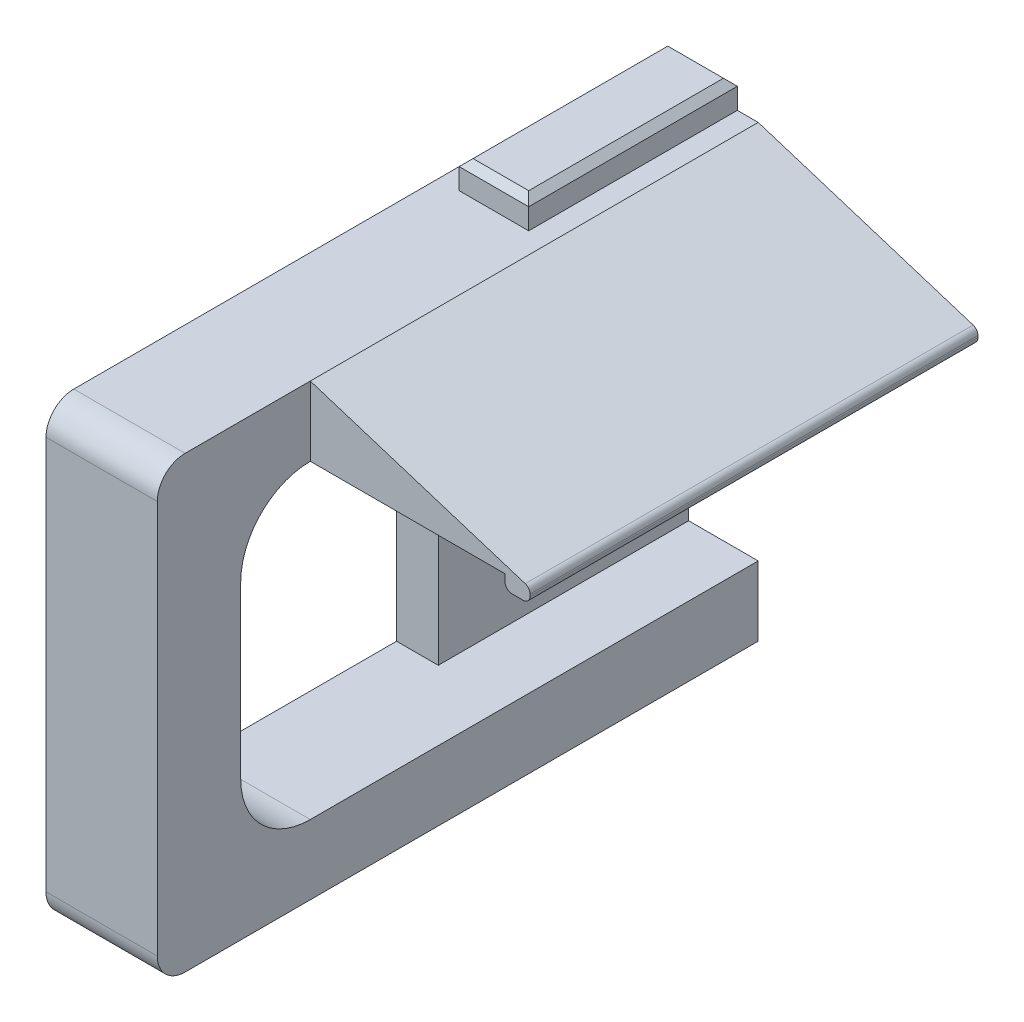
ISO-10303-21;
HEADER;
FILE_DESCRIPTION(('STEP AP214'),'2;1');
FILE_NAME('part.step','',(''),(''),'','','');
FILE_SCHEMA(('AUTOMOTIVE_DESIGN { 1 0 10303 214 1 1 1 1 }'));
ENDSEC;
DATA;
#1=APPLICATION_CONTEXT('core data for automotive mechanical design processes');
#2=APPLICATION_PROTOCOL_DEFINITION('international standard','automotive_design',2000,#1);
#3=PRODUCT_CONTEXT('',#1,'mechanical');
#4=PRODUCT('Part','Part','',(#3));
#5=PRODUCT_RELATED_PRODUCT_CATEGORY('part','',(#4));
#6=PRODUCT_DEFINITION_FORMATION('','',#4);
#7=PRODUCT_DEFINITION_CONTEXT('part definition',#1,'design');
#8=PRODUCT_DEFINITION('design','',#6,#7);
#9=PRODUCT_DEFINITION_SHAPE('','',#8);
#10=(LENGTH_UNIT() NAMED_UNIT(*) SI_UNIT(.MILLI.,.METRE.));
#11=(NAMED_UNIT(*) PLANE_ANGLE_UNIT() SI_UNIT($,.RADIAN.));
#12=(NAMED_UNIT(*) SI_UNIT($,.STERADIAN.) SOLID_ANGLE_UNIT());
#13=UNCERTAINTY_MEASURE_WITH_UNIT(LENGTH_MEASURE(1.E-05),#10,'distance_accuracy_value','');
#14=(GEOMETRIC_REPRESENTATION_CONTEXT(3) GLOBAL_UNCERTAINTY_ASSIGNED_CONTEXT((#13)) GLOBAL_UNIT_ASSIGNED_CONTEXT((#10,
#11,#12)) REPRESENTATION_CONTEXT('',''));
#15=CARTESIAN_POINT('',(0.,0.,0.));
#16=DIRECTION('',(0.,0.,1.));
#17=DIRECTION('',(1.,0.,0.));
#18=AXIS2_PLACEMENT_3D('',#15,#16,#17);
#19=CARTESIAN_POINT('',(-3.,27.3,0.));
#20=DIRECTION('',(0.,-1.,0.));
#21=DIRECTION('',(0.,0.,-1.));
#22=AXIS2_PLACEMENT_3D('',#19,#20,#21);
#23=PLANE('',#22);
#24=DIRECTION('',(0.,0.,1.));
#25=VECTOR('',#24,1.);
#26=CARTESIAN_POINT('',(3.49999999999992,27.3,15.));
#27=LINE('',#26,#25);
#28=CARTESIAN_POINT('',(3.49999999999992,27.3,0.));
#29=VERTEX_POINT('',#28);
#30=CARTESIAN_POINT('',(3.49999999999992,27.3,15.));
#31=VERTEX_POINT('',#30);
#32=EDGE_CURVE('E234',#29,#31,#27,.T.);
#33=ORIENTED_EDGE('',*,*,#32,.T.);
#34=DIRECTION('',(-1.,0.,0.));
#35=VECTOR('',#34,1.);
#36=CARTESIAN_POINT('',(3.49999999999992,27.3,15.));
#37=LINE('',#36,#35);
#38=CARTESIAN_POINT('',(-1.50000000000008,27.3,15.));
#39=VERTEX_POINT('',#38);
#40=EDGE_CURVE('E245',#31,#39,#37,.T.);
#41=ORIENTED_EDGE('',*,*,#40,.T.);
#42=DIRECTION('',(0.,0.,-1.));
#43=VECTOR('',#42,1.);
#44=CARTESIAN_POINT('',(-1.50000000000008,27.3,15.));
#45=LINE('',#44,#43);
#46=CARTESIAN_POINT('',(-1.50000000000007,27.3,0.));
#47=VERTEX_POINT('',#46);
#48=EDGE_CURVE('E229',#39,#47,#45,.T.);
#49=ORIENTED_EDGE('',*,*,#48,.T.);
#50=DIRECTION('',(1.,0.,0.));
#51=VECTOR('',#50,1.);
#52=CARTESIAN_POINT('',(-3.,27.3,0.));
#53=LINE('',#52,#51);
#54=CARTESIAN_POINT('',(-3.,27.3,0.));
#55=VERTEX_POINT('',#54);
#56=EDGE_CURVE('E238',#55,#47,#53,.T.);
#57=ORIENTED_EDGE('',*,*,#56,.F.);
#58=DIRECTION('',(0.,0.,1.));
#59=VECTOR('',#58,1.);
#60=CARTESIAN_POINT('',(-3.,27.3,0.));
#61=LINE('',#60,#59);
#62=CARTESIAN_POINT('',(-3.,27.3,41.2));
#63=VERTEX_POINT('',#62);
#64=EDGE_CURVE('E361',#55,#63,#61,.T.);
#65=ORIENTED_EDGE('',*,*,#64,.T.);
#66=DIRECTION('',(1.,0.,0.));
#67=VECTOR('',#66,1.);
#68=CARTESIAN_POINT('',(-3.,27.3,41.2));
#69=LINE('',#68,#67);
#70=CARTESIAN_POINT('',(5.,27.3,41.2));
#71=VERTEX_POINT('',#70);
#72=EDGE_CURVE('E239',#63,#71,#69,.T.);
#73=ORIENTED_EDGE('',*,*,#72,.T.);
#74=DIRECTION('',(0.,0.,1.));
#75=VECTOR('',#74,1.);
#76=CARTESIAN_POINT('',(5.,27.3,0.));
#77=LINE('',#76,#75);
#78=CARTESIAN_POINT('',(5.,27.3,32.2));
#79=VERTEX_POINT('',#78);
#80=EDGE_CURVE('E330',#79,#71,#77,.T.);
#81=ORIENTED_EDGE('',*,*,#80,.F.);
#82=DIRECTION('',(0.,0.,1.));
#83=VECTOR('',#82,1.);
#84=CARTESIAN_POINT('',(4.99999999999985,27.3,32.2));
#85=LINE('',#84,#83);
#86=CARTESIAN_POINT('',(4.99999999999985,27.3,0.));
#87=VERTEX_POINT('',#86);
#88=EDGE_CURVE('E237',#87,#79,#85,.T.);
#89=ORIENTED_EDGE('',*,*,#88,.F.);
#90=EDGE_CURVE('E220',#29,#87,#53,.T.);
#91=ORIENTED_EDGE('',*,*,#90,.F.);
#92=EDGE_LOOP('',(#33,#41,#49,#57,#65,#73,#81,#89,#91));
#93=FACE_BOUND('',#92,.T.);
#94=ADVANCED_FACE('F35',(#93),#23,.F.);
#95=CARTESIAN_POINT('',(-3.,22.3,0.));
#96=DIRECTION('',(0.,1.,0.));
#97=DIRECTION('',(0.,0.,1.));
#98=AXIS2_PLACEMENT_3D('',#95,#96,#97);
#99=PLANE('',#98);
#100=DIRECTION('',(0.,0.,1.));
#101=VECTOR('',#100,1.);
#102=CARTESIAN_POINT('',(19.,22.3,0.));
#103=LINE('',#102,#101);
#104=CARTESIAN_POINT('',(19.,22.3,0.));
#105=VERTEX_POINT('',#104);
#106=CARTESIAN_POINT('',(19.,22.3,32.2));
#107=VERTEX_POINT('',#106);
#108=EDGE_CURVE('E255',#105,#107,#103,.T.);
#109=ORIENTED_EDGE('',*,*,#108,.T.);
#110=DIRECTION('',(-1.,0.,0.));
#111=VECTOR('',#110,1.);
#112=CARTESIAN_POINT('',(20.8,22.3,32.2));
#113=LINE('',#112,#111);
#114=CARTESIAN_POINT('',(5.,22.3,32.2));
#115=VERTEX_POINT('',#114);
#116=EDGE_CURVE('E277',#107,#115,#113,.T.);
#117=ORIENTED_EDGE('',*,*,#116,.T.);
#118=DIRECTION('',(1.,0.,0.));
#119=VECTOR('',#118,1.);
#120=CARTESIAN_POINT('',(-3.,22.3,32.2));
#121=LINE('',#120,#119);
#122=CARTESIAN_POINT('',(-3.,22.3,32.2));
#123=VERTEX_POINT('',#122);
#124=EDGE_CURVE('E389',#123,#115,#121,.T.);
#125=ORIENTED_EDGE('',*,*,#124,.F.);
#126=DIRECTION('',(0.,0.,-1.));
#127=VECTOR('',#126,1.);
#128=CARTESIAN_POINT('',(-3.,22.3,0.));
#129=LINE('',#128,#127);
#130=CARTESIAN_POINT('',(-3.,22.3,18.));
#131=VERTEX_POINT('',#130);
#132=EDGE_CURVE('E358',#123,#131,#129,.T.);
#133=ORIENTED_EDGE('',*,*,#132,.T.);
#134=DIRECTION('',(1.,0.,0.));
#135=VECTOR('',#134,1.);
#136=CARTESIAN_POINT('',(-3.,22.3,18.));
#137=LINE('',#136,#135);
#138=CARTESIAN_POINT('',(0.,22.3,18.));
#139=VERTEX_POINT('',#138);
#140=EDGE_CURVE('E301',#131,#139,#137,.T.);
#141=ORIENTED_EDGE('',*,*,#140,.T.);
#142=DIRECTION('',(0.,0.,-1.));
#143=VECTOR('',#142,1.);
#144=CARTESIAN_POINT('',(0.,22.3,0.));
#145=LINE('',#144,#143);
#146=CARTESIAN_POINT('',(0.,22.3,0.));
#147=VERTEX_POINT('',#146);
#148=EDGE_CURVE('E310',#139,#147,#145,.T.);
#149=ORIENTED_EDGE('',*,*,#148,.T.);
#150=DIRECTION('',(1.,0.,0.));
#151=VECTOR('',#150,1.);
#152=CARTESIAN_POINT('',(-3.,22.3,0.));
#153=LINE('',#152,#151);
#154=EDGE_CURVE('E386',#147,#105,#153,.T.);
#155=ORIENTED_EDGE('',*,*,#154,.T.);
#156=EDGE_LOOP('',(#109,#117,#125,#133,#141,#149,#155));
#157=FACE_BOUND('',#156,.T.);
#158=ADVANCED_FACE('F517',(#157),#99,.F.);
#159=CARTESIAN_POINT('',(5.,5.,32.2));
#160=DIRECTION('',(-1.,0.,0.));
#161=DIRECTION('',(0.,0.,-1.));
#162=AXIS2_PLACEMENT_3D('',#159,#160,#161);
#163=PLANE('',#162);
#164=DIRECTION('',(0.,1.,0.));
#165=VECTOR('',#164,1.);
#166=CARTESIAN_POINT('',(5.,27.3,32.2));
#167=LINE('',#166,#165);
#168=EDGE_CURVE('E274',#115,#79,#167,.T.);
#169=ORIENTED_EDGE('',*,*,#168,.T.);
#170=ORIENTED_EDGE('',*,*,#80,.T.);
#171=CARTESIAN_POINT('',(5.,25.3,41.2));
#172=DIRECTION('',(1.,0.,0.));
#173=DIRECTION('',(0.,0.,-1.));
#174=AXIS2_PLACEMENT_3D('',#171,#172,#173);
#175=CIRCLE('',#174,2.);
#176=CARTESIAN_POINT('',(5.,25.3,43.2));
#177=VERTEX_POINT('',#176);
#178=EDGE_CURVE('E333',#71,#177,#175,.T.);
#179=ORIENTED_EDGE('',*,*,#178,.T.);
#180=DIRECTION('',(0.,-1.,0.));
#181=VECTOR('',#180,1.);
#182=CARTESIAN_POINT('',(5.,25.3,43.2));
#183=LINE('',#182,#181);
#184=CARTESIAN_POINT('',(5.,-3.,43.2));
#185=VERTEX_POINT('',#184);
#186=EDGE_CURVE('E336',#177,#185,#183,.T.);
#187=ORIENTED_EDGE('',*,*,#186,.T.);
#188=CARTESIAN_POINT('',(5.,-3.,41.2));
#189=DIRECTION('',(1.,0.,0.));
#190=DIRECTION('',(0.,0.,1.));
#191=AXIS2_PLACEMENT_3D('',#188,#189,#190);
#192=CIRCLE('',#191,2.);
#193=CARTESIAN_POINT('',(5.,-5.,41.2));
#194=VERTEX_POINT('',#193);
#195=EDGE_CURVE('E339',#185,#194,#192,.T.);
#196=ORIENTED_EDGE('',*,*,#195,.T.);
#197=DIRECTION('',(0.,0.,-1.));
#198=VECTOR('',#197,1.);
#199=CARTESIAN_POINT('',(5.,-5.,41.2));
#200=LINE('',#199,#198);
#201=CARTESIAN_POINT('',(5.,-5.,0.));
#202=VERTEX_POINT('',#201);
#203=EDGE_CURVE('E342',#194,#202,#200,.T.);
#204=ORIENTED_EDGE('',*,*,#203,.T.);
#205=DIRECTION('',(0.,1.,0.));
#206=VECTOR('',#205,1.);
#207=CARTESIAN_POINT('',(5.,-5.,0.));
#208=LINE('',#207,#206);
#209=CARTESIAN_POINT('',(5.,0.,0.));
#210=VERTEX_POINT('',#209);
#211=EDGE_CURVE('E316',#202,#210,#208,.T.);
#212=ORIENTED_EDGE('',*,*,#211,.T.);
#213=DIRECTION('',(0.,0.,1.));
#214=VECTOR('',#213,1.);
#215=CARTESIAN_POINT('',(5.,0.,0.));
#216=LINE('',#215,#214);
#217=CARTESIAN_POINT('',(5.,0.,32.2));
#218=VERTEX_POINT('',#217);
#219=EDGE_CURVE('E319',#210,#218,#216,.T.);
#220=ORIENTED_EDGE('',*,*,#219,.T.);
#221=CARTESIAN_POINT('',(5.,5.,32.2));
#222=DIRECTION('',(-1.,0.,0.));
#223=DIRECTION('',(0.,0.,-1.));
#224=AXIS2_PLACEMENT_3D('',#221,#222,#223);
#225=CIRCLE('',#224,5.);
#226=CARTESIAN_POINT('',(5.,5.,37.2));
#227=VERTEX_POINT('',#226);
#228=EDGE_CURVE('E322',#218,#227,#225,.T.);
#229=ORIENTED_EDGE('',*,*,#228,.T.);
#230=DIRECTION('',(0.,1.,0.));
#231=VECTOR('',#230,1.);
#232=CARTESIAN_POINT('',(5.,5.,37.2));
#233=LINE('',#232,#231);
#234=CARTESIAN_POINT('',(5.,17.3,37.2));
#235=VERTEX_POINT('',#234);
#236=EDGE_CURVE('E325',#227,#235,#233,.T.);
#237=ORIENTED_EDGE('',*,*,#236,.T.);
#238=CARTESIAN_POINT('',(5.,17.3,32.2));
#239=DIRECTION('',(-1.,0.,0.));
#240=DIRECTION('',(0.,0.,1.));
#241=AXIS2_PLACEMENT_3D('',#238,#239,#240);
#242=CIRCLE('',#241,5.);
#243=EDGE_CURVE('E328',#235,#115,#242,.T.);
#244=ORIENTED_EDGE('',*,*,#243,.T.);
#245=EDGE_LOOP('',(#169,#170,#179,#187,#196,#204,#212,#220,#229,#237,#244));
#246=FACE_BOUND('',#245,.T.);
#247=ADVANCED_FACE('F483',(#246),#163,.F.);
#248=CARTESIAN_POINT('',(-3.,0.,0.));
#249=DIRECTION('',(0.,-1.,0.));
#250=DIRECTION('',(0.,0.,-1.));
#251=AXIS2_PLACEMENT_3D('',#248,#249,#250);
#252=PLANE('',#251);
#253=DIRECTION('',(0.,0.,1.));
#254=VECTOR('',#253,1.);
#255=CARTESIAN_POINT('',(0.,0.,0.));
#256=LINE('',#255,#254);
#257=CARTESIAN_POINT('',(0.,0.,0.));
#258=VERTEX_POINT('',#257);
#259=CARTESIAN_POINT('',(0.,0.,18.));
#260=VERTEX_POINT('',#259);
#261=EDGE_CURVE('E313',#258,#260,#256,.T.);
#262=ORIENTED_EDGE('',*,*,#261,.T.);
#263=DIRECTION('',(-1.,0.,0.));
#264=VECTOR('',#263,1.);
#265=CARTESIAN_POINT('',(-3.,0.,18.));
#266=LINE('',#265,#264);
#267=CARTESIAN_POINT('',(-3.,0.,18.));
#268=VERTEX_POINT('',#267);
#269=EDGE_CURVE('E307',#260,#268,#266,.T.);
#270=ORIENTED_EDGE('',*,*,#269,.T.);
#271=DIRECTION('',(0.,0.,1.));
#272=VECTOR('',#271,1.);
#273=CARTESIAN_POINT('',(-3.,0.,0.));
#274=LINE('',#273,#272);
#275=CARTESIAN_POINT('',(-3.,0.,32.2));
#276=VERTEX_POINT('',#275);
#277=EDGE_CURVE('E347',#268,#276,#274,.T.);
#278=ORIENTED_EDGE('',*,*,#277,.T.);
#279=DIRECTION('',(1.,0.,0.));
#280=VECTOR('',#279,1.);
#281=CARTESIAN_POINT('',(-3.,0.,32.2));
#282=LINE('',#281,#280);
#283=EDGE_CURVE('E396',#276,#218,#282,.T.);
#284=ORIENTED_EDGE('',*,*,#283,.T.);
#285=ORIENTED_EDGE('',*,*,#219,.F.);
#286=DIRECTION('',(1.,0.,0.));
#287=VECTOR('',#286,1.);
#288=CARTESIAN_POINT('',(-3.,0.,0.));
#289=LINE('',#288,#287);
#290=EDGE_CURVE('E398',#258,#210,#289,.T.);
#291=ORIENTED_EDGE('',*,*,#290,.F.);
#292=EDGE_LOOP('',(#262,#270,#278,#284,#285,#291));
#293=FACE_BOUND('',#292,.T.);
#294=ADVANCED_FACE('F527',(#293),#252,.F.);
#295=CARTESIAN_POINT('',(-3.,5.,32.2));
#296=DIRECTION('',(1.,0.,0.));
#297=DIRECTION('',(0.,0.,1.));
#298=AXIS2_PLACEMENT_3D('',#295,#296,#297);
#299=CYLINDRICAL_SURFACE('',#298,5.);
#300=ORIENTED_EDGE('',*,*,#283,.F.);
#301=CARTESIAN_POINT('',(-3.,5.,32.2));
#302=DIRECTION('',(-1.,0.,0.));
#303=DIRECTION('',(0.,0.,-1.));
#304=AXIS2_PLACEMENT_3D('',#301,#302,#303);
#305=CIRCLE('',#304,5.);
#306=CARTESIAN_POINT('',(-3.,5.,37.2));
#307=VERTEX_POINT('',#306);
#308=EDGE_CURVE('E350',#276,#307,#305,.T.);
#309=ORIENTED_EDGE('',*,*,#308,.T.);
#310=DIRECTION('',(1.,0.,0.));
#311=VECTOR('',#310,1.);
#312=CARTESIAN_POINT('',(-3.,5.,37.2));
#313=LINE('',#312,#311);
#314=EDGE_CURVE('E394',#307,#227,#313,.T.);
#315=ORIENTED_EDGE('',*,*,#314,.T.);
#316=ORIENTED_EDGE('',*,*,#228,.F.);
#317=EDGE_LOOP('',(#300,#309,#315,#316));
#318=FACE_BOUND('',#317,.T.);
#319=ADVANCED_FACE('F565',(#318),#299,.F.);
#320=CARTESIAN_POINT('',(-3.,5.,37.2));
#321=DIRECTION('',(0.,0.,1.));
#322=DIRECTION('',(0.,-1.,0.));
#323=AXIS2_PLACEMENT_3D('',#320,#321,#322);
#324=PLANE('',#323);
#325=ORIENTED_EDGE('',*,*,#314,.F.);
#326=DIRECTION('',(0.,1.,0.));
#327=VECTOR('',#326,1.);
#328=CARTESIAN_POINT('',(-3.,5.,37.2));
#329=LINE('',#328,#327);
#330=CARTESIAN_POINT('',(-3.,17.3,37.2));
#331=VERTEX_POINT('',#330);
#332=EDGE_CURVE('E353',#307,#331,#329,.T.);
#333=ORIENTED_EDGE('',*,*,#332,.T.);
#334=DIRECTION('',(1.,0.,0.));
#335=VECTOR('',#334,1.);
#336=CARTESIAN_POINT('',(-3.,17.3,37.2));
#337=LINE('',#336,#335);
#338=EDGE_CURVE('E392',#331,#235,#337,.T.);
#339=ORIENTED_EDGE('',*,*,#338,.T.);
#340=ORIENTED_EDGE('',*,*,#236,.F.);
#341=EDGE_LOOP('',(#325,#333,#339,#340));
#342=FACE_BOUND('',#341,.T.);
#343=ADVANCED_FACE('F561',(#342),#324,.F.);
#344=CARTESIAN_POINT('',(-3.,17.3,32.2));
#345=DIRECTION('',(1.,0.,0.));
#346=DIRECTION('',(0.,0.,1.));
#347=AXIS2_PLACEMENT_3D('',#344,#345,#346);
#348=CYLINDRICAL_SURFACE('',#347,5.);
#349=ORIENTED_EDGE('',*,*,#338,.F.);
#350=CARTESIAN_POINT('',(-3.,17.3,32.2));
#351=DIRECTION('',(-1.,0.,0.));
#352=DIRECTION('',(0.,0.,1.));
#353=AXIS2_PLACEMENT_3D('',#350,#351,#352);
#354=CIRCLE('',#353,5.);
#355=EDGE_CURVE('E356',#331,#123,#354,.T.);
#356=ORIENTED_EDGE('',*,*,#355,.T.);
#357=ORIENTED_EDGE('',*,*,#124,.T.);
#358=ORIENTED_EDGE('',*,*,#243,.F.);
#359=EDGE_LOOP('',(#349,#356,#357,#358));
#360=FACE_BOUND('',#359,.T.);
#361=ADVANCED_FACE('F557',(#360),#348,.F.);
#362=CARTESIAN_POINT('',(-3.,22.3,0.));
#363=DIRECTION('',(0.,0.,1.));
#364=DIRECTION('',(0.,-1.,0.));
#365=AXIS2_PLACEMENT_3D('',#362,#363,#364);
#366=PLANE('',#365);
#367=DIRECTION('',(0.,-1.,0.));
#368=VECTOR('',#367,1.);
#369=CARTESIAN_POINT('',(3.49999999999992,29.3,0.));
#370=LINE('',#369,#368);
#371=CARTESIAN_POINT('',(3.49999999999992,28.8,0.));
#372=VERTEX_POINT('',#371);
#373=EDGE_CURVE('E216',#372,#29,#370,.T.);
#374=ORIENTED_EDGE('',*,*,#373,.T.);
#375=ORIENTED_EDGE('',*,*,#90,.T.);
#376=DIRECTION('',(-0.953400096931816,0.301708891434116,0.));
#377=VECTOR('',#376,1.);
#378=CARTESIAN_POINT('',(20.8,22.3,0.));
#379=LINE('',#378,#377);
#380=CARTESIAN_POINT('',(20.4508544457171,22.4104890994566,0.));
#381=VERTEX_POINT('',#380);
#382=EDGE_CURVE('E400',#381,#87,#379,.T.);
#383=ORIENTED_EDGE('',*,*,#382,.F.);
#384=CARTESIAN_POINT('',(20.3,21.9337890509907,0.));
#385=DIRECTION('',(0.,0.,-1.));
#386=DIRECTION('',(0.,-1.,0.));
#387=AXIS2_PLACEMENT_3D('',#384,#385,#386);
#388=CIRCLE('',#387,0.5);
#389=CARTESIAN_POINT('',(20.8,21.9337890509907,0.));
#390=VERTEX_POINT('',#389);
#391=EDGE_CURVE('E427',#390,#381,#388,.F.);
#392=ORIENTED_EDGE('',*,*,#391,.F.);
#393=DIRECTION('',(0.,1.,0.));
#394=VECTOR('',#393,1.);
#395=CARTESIAN_POINT('',(20.8,21.3,0.));
#396=LINE('',#395,#394);
#397=CARTESIAN_POINT('',(20.8,21.8,0.));
#398=VERTEX_POINT('',#397);
#399=EDGE_CURVE('E271',#398,#390,#396,.T.);
#400=ORIENTED_EDGE('',*,*,#399,.F.);
#401=CARTESIAN_POINT('',(20.3,21.8,0.));
#402=DIRECTION('',(0.,0.,-1.));
#403=DIRECTION('',(0.,-1.,0.));
#404=AXIS2_PLACEMENT_3D('',#401,#402,#403);
#405=CIRCLE('',#404,0.5);
#406=CARTESIAN_POINT('',(20.3,21.3,0.));
#407=VERTEX_POINT('',#406);
#408=EDGE_CURVE('E424',#407,#398,#405,.F.);
#409=ORIENTED_EDGE('',*,*,#408,.F.);
#410=DIRECTION('',(-1.,0.,0.));
#411=VECTOR('',#410,1.);
#412=CARTESIAN_POINT('',(20.8,21.3,0.));
#413=LINE('',#412,#411);
#414=CARTESIAN_POINT('',(19.5,21.3,0.));
#415=VERTEX_POINT('',#414);
#416=EDGE_CURVE('E256',#407,#415,#413,.T.);
#417=ORIENTED_EDGE('',*,*,#416,.T.);
#418=CARTESIAN_POINT('',(19.5,21.8,0.));
#419=DIRECTION('',(0.,0.,-1.));
#420=DIRECTION('',(0.,-1.,0.));
#421=AXIS2_PLACEMENT_3D('',#418,#419,#420);
#422=CIRCLE('',#421,0.5);
#423=CARTESIAN_POINT('',(19.,21.8,0.));
#424=VERTEX_POINT('',#423);
#425=EDGE_CURVE('E421',#424,#415,#422,.F.);
#426=ORIENTED_EDGE('',*,*,#425,.F.);
#427=DIRECTION('',(0.,1.,0.));
#428=VECTOR('',#427,1.);
#429=CARTESIAN_POINT('',(19.,21.3,0.));
#430=LINE('',#429,#428);
#431=EDGE_CURVE('E269',#424,#105,#430,.T.);
#432=ORIENTED_EDGE('',*,*,#431,.T.);
#433=ORIENTED_EDGE('',*,*,#154,.F.);
#434=DIRECTION('',(0.,1.,0.));
#435=VECTOR('',#434,1.);
#436=CARTESIAN_POINT('',(0.,-5.,0.));
#437=LINE('',#436,#435);
#438=EDGE_CURVE('E296',#258,#147,#437,.T.);
#439=ORIENTED_EDGE('',*,*,#438,.F.);
#440=ORIENTED_EDGE('',*,*,#290,.T.);
#441=ORIENTED_EDGE('',*,*,#211,.F.);
#442=DIRECTION('',(1.,0.,0.));
#443=VECTOR('',#442,1.);
#444=CARTESIAN_POINT('',(-3.,-5.,0.));
#445=LINE('',#444,#443);
#446=CARTESIAN_POINT('',(-3.,-5.,0.));
#447=VERTEX_POINT('',#446);
#448=EDGE_CURVE('E375',#447,#202,#445,.T.);
#449=ORIENTED_EDGE('',*,*,#448,.F.);
#450=DIRECTION('',(0.,1.,0.));
#451=VECTOR('',#450,1.);
#452=CARTESIAN_POINT('',(-3.,-5.,0.));
#453=LINE('',#452,#451);
#454=EDGE_CURVE('E345',#447,#55,#453,.T.);
#455=ORIENTED_EDGE('',*,*,#454,.T.);
#456=ORIENTED_EDGE('',*,*,#56,.T.);
#457=DIRECTION('',(0.,-1.,0.));
#458=VECTOR('',#457,1.);
#459=CARTESIAN_POINT('',(-1.50000000000007,29.3,0.));
#460=LINE('',#459,#458);
#461=CARTESIAN_POINT('',(-1.50000000000007,28.8,0.));
#462=VERTEX_POINT('',#461);
#463=EDGE_CURVE('E228',#462,#47,#460,.T.);
#464=ORIENTED_EDGE('',*,*,#463,.F.);
#465=DIRECTION('',(-1.,0.,0.));
#466=VECTOR('',#465,1.);
#467=CARTESIAN_POINT('',(-3.,28.8,0.));
#468=LINE('',#467,#466);
#469=EDGE_CURVE('E224',#372,#462,#468,.T.);
#470=ORIENTED_EDGE('',*,*,#469,.F.);
#471=EDGE_LOOP('',(#374,#375,#383,#392,#400,#409,#417,#426,#432,#433,#439,#440,#441,#449,#455,
#456,#464,#470));
#472=FACE_BOUND('',#471,.T.);
#473=ADVANCED_FACE('F218',(#472),#366,.F.);
#474=CARTESIAN_POINT('',(-3.,25.3,41.2));
#475=DIRECTION('',(1.,0.,0.));
#476=DIRECTION('',(0.,0.,1.));
#477=AXIS2_PLACEMENT_3D('',#474,#475,#476);
#478=CYLINDRICAL_SURFACE('',#477,2.);
#479=ORIENTED_EDGE('',*,*,#72,.F.);
#480=CARTESIAN_POINT('',(-3.,25.3,41.2));
#481=DIRECTION('',(1.,0.,0.));
#482=DIRECTION('',(0.,0.,-1.));
#483=AXIS2_PLACEMENT_3D('',#480,#481,#482);
#484=CIRCLE('',#483,2.);
#485=CARTESIAN_POINT('',(-3.,25.3,43.2));
#486=VERTEX_POINT('',#485);
#487=EDGE_CURVE('E364',#63,#486,#484,.T.);
#488=ORIENTED_EDGE('',*,*,#487,.T.);
#489=DIRECTION('',(1.,0.,0.));
#490=VECTOR('',#489,1.);
#491=CARTESIAN_POINT('',(-3.,25.3,43.2));
#492=LINE('',#491,#490);
#493=EDGE_CURVE('E381',#486,#177,#492,.T.);
#494=ORIENTED_EDGE('',*,*,#493,.T.);
#495=ORIENTED_EDGE('',*,*,#178,.F.);
#496=EDGE_LOOP('',(#479,#488,#494,#495));
#497=FACE_BOUND('',#496,.T.);
#498=ADVANCED_FACE('F481',(#497),#478,.T.);
#499=CARTESIAN_POINT('',(-3.,25.3,43.2));
#500=DIRECTION('',(0.,0.,-1.));
#501=DIRECTION('',(0.,1.,0.));
#502=AXIS2_PLACEMENT_3D('',#499,#500,#501);
#503=PLANE('',#502);
#504=ORIENTED_EDGE('',*,*,#493,.F.);
#505=DIRECTION('',(0.,-1.,0.));
#506=VECTOR('',#505,1.);
#507=CARTESIAN_POINT('',(-3.,25.3,43.2));
#508=LINE('',#507,#506);
#509=CARTESIAN_POINT('',(-3.,-3.,43.2));
#510=VERTEX_POINT('',#509);
#511=EDGE_CURVE('E367',#486,#510,#508,.T.);
#512=ORIENTED_EDGE('',*,*,#511,.T.);
#513=DIRECTION('',(1.,0.,0.));
#514=VECTOR('',#513,1.);
#515=CARTESIAN_POINT('',(-3.,-3.,43.2));
#516=LINE('',#515,#514);
#517=EDGE_CURVE('E379',#510,#185,#516,.T.);
#518=ORIENTED_EDGE('',*,*,#517,.T.);
#519=ORIENTED_EDGE('',*,*,#186,.F.);
#520=EDGE_LOOP('',(#504,#512,#518,#519));
#521=FACE_BOUND('',#520,.T.);
#522=ADVANCED_FACE('F540',(#521),#503,.F.);
#523=CARTESIAN_POINT('',(-3.,-3.,41.2));
#524=DIRECTION('',(1.,0.,0.));
#525=DIRECTION('',(0.,0.,1.));
#526=AXIS2_PLACEMENT_3D('',#523,#524,#525);
#527=CYLINDRICAL_SURFACE('',#526,2.);
#528=ORIENTED_EDGE('',*,*,#517,.F.);
#529=CARTESIAN_POINT('',(-3.,-3.,41.2));
#530=DIRECTION('',(1.,0.,0.));
#531=DIRECTION('',(0.,0.,1.));
#532=AXIS2_PLACEMENT_3D('',#529,#530,#531);
#533=CIRCLE('',#532,2.);
#534=CARTESIAN_POINT('',(-3.,-5.,41.2));
#535=VERTEX_POINT('',#534);
#536=EDGE_CURVE('E370',#510,#535,#533,.T.);
#537=ORIENTED_EDGE('',*,*,#536,.T.);
#538=DIRECTION('',(1.,0.,0.));
#539=VECTOR('',#538,1.);
#540=CARTESIAN_POINT('',(-3.,-5.,41.2));
#541=LINE('',#540,#539);
#542=EDGE_CURVE('E377',#535,#194,#541,.T.);
#543=ORIENTED_EDGE('',*,*,#542,.T.);
#544=ORIENTED_EDGE('',*,*,#195,.F.);
#545=EDGE_LOOP('',(#528,#537,#543,#544));
#546=FACE_BOUND('',#545,.T.);
#547=ADVANCED_FACE('F537',(#546),#527,.T.);
#548=CARTESIAN_POINT('',(-3.,-5.,41.2));
#549=DIRECTION('',(0.,1.,0.));
#550=DIRECTION('',(0.,0.,1.));
#551=AXIS2_PLACEMENT_3D('',#548,#549,#550);
#552=PLANE('',#551);
#553=ORIENTED_EDGE('',*,*,#203,.F.);
#554=ORIENTED_EDGE('',*,*,#542,.F.);
#555=DIRECTION('',(0.,0.,-1.));
#556=VECTOR('',#555,1.);
#557=CARTESIAN_POINT('',(-3.,-5.,41.2));
#558=LINE('',#557,#556);
#559=EDGE_CURVE('E373',#535,#447,#558,.T.);
#560=ORIENTED_EDGE('',*,*,#559,.T.);
#561=ORIENTED_EDGE('',*,*,#448,.T.);
#562=EDGE_LOOP('',(#553,#554,#560,#561));
#563=FACE_BOUND('',#562,.T.);
#564=ADVANCED_FACE('F534',(#563),#552,.F.);
#565=CARTESIAN_POINT('',(-3.,5.,32.2));
#566=DIRECTION('',(-1.,0.,0.));
#567=DIRECTION('',(0.,0.,-1.));
#568=AXIS2_PLACEMENT_3D('',#565,#566,#567);
#569=PLANE('',#568);
#570=CARTESIAN_POINT('',(-3.,2.5,5.45));
#571=DIRECTION('',(1.,0.,0.));
#572=DIRECTION('',(0.,0.,-1.));
#573=AXIS2_PLACEMENT_3D('',#570,#571,#572);
#574=CIRCLE('',#573,1.5);
#575=CARTESIAN_POINT('',(-3.,2.5,3.95));
#576=VERTEX_POINT('',#575);
#577=EDGE_CURVE('E281',#576,#576,#574,.T.);
#578=ORIENTED_EDGE('',*,*,#577,.T.);
#579=EDGE_LOOP('',(#578));
#580=FACE_BOUND('',#579,.T.);
#581=CARTESIAN_POINT('',(-3.,19.8,5.45));
#582=DIRECTION('',(1.,0.,0.));
#583=DIRECTION('',(0.,0.,1.));
#584=AXIS2_PLACEMENT_3D('',#581,#582,#583);
#585=CIRCLE('',#584,1.5);
#586=CARTESIAN_POINT('',(-3.,19.8,6.95));
#587=VERTEX_POINT('',#586);
#588=EDGE_CURVE('E280',#587,#587,#585,.T.);
#589=ORIENTED_EDGE('',*,*,#588,.T.);
#590=EDGE_LOOP('',(#589));
#591=FACE_BOUND('',#590,.T.);
#592=DIRECTION('',(0.,-1.,0.));
#593=VECTOR('',#592,1.);
#594=CARTESIAN_POINT('',(-3.,-5.,18.));
#595=LINE('',#594,#593);
#596=EDGE_CURVE('E299',#131,#268,#595,.T.);
#597=ORIENTED_EDGE('',*,*,#596,.F.);
#598=ORIENTED_EDGE('',*,*,#132,.F.);
#599=ORIENTED_EDGE('',*,*,#355,.F.);
#600=ORIENTED_EDGE('',*,*,#332,.F.);
#601=ORIENTED_EDGE('',*,*,#308,.F.);
#602=ORIENTED_EDGE('',*,*,#277,.F.);
#603=EDGE_LOOP('',(#597,#598,#599,#600,#601,#602));
#604=FACE_BOUND('',#603,.T.);
#605=ORIENTED_EDGE('',*,*,#64,.F.);
#606=ORIENTED_EDGE('',*,*,#454,.F.);
#607=ORIENTED_EDGE('',*,*,#559,.F.);
#608=ORIENTED_EDGE('',*,*,#536,.F.);
#609=ORIENTED_EDGE('',*,*,#511,.F.);
#610=ORIENTED_EDGE('',*,*,#487,.F.);
#611=EDGE_LOOP('',(#605,#606,#607,#608,#609,#610));
#612=FACE_BOUND('',#611,.T.);
#613=CARTESIAN_POINT('',(-3.,11.15,14.87));
#614=DIRECTION('',(1.,0.,0.));
#615=DIRECTION('',(0.,0.,-1.));
#616=AXIS2_PLACEMENT_3D('',#613,#614,#615);
#617=CIRCLE('',#616,1.9);
#618=CARTESIAN_POINT('',(-3.,11.15,12.97));
#619=VERTEX_POINT('',#618);
#620=EDGE_CURVE('E293',#619,#619,#617,.T.);
#621=ORIENTED_EDGE('',*,*,#620,.T.);
#622=EDGE_LOOP('',(#621));
#623=FACE_BOUND('',#622,.T.);
#624=ADVANCED_FACE('F476',(#580,#591,#604,#612,#623),#569,.T.);
#625=CARTESIAN_POINT('',(0.,0.,0.));
#626=DIRECTION('',(-1.,0.,0.));
#627=DIRECTION('',(0.,0.,-1.));
#628=AXIS2_PLACEMENT_3D('',#625,#626,#627);
#629=PLANE('',#628);
#630=CARTESIAN_POINT('',(0.,2.5,5.45));
#631=DIRECTION('',(1.,0.,0.));
#632=DIRECTION('',(0.,0.,-1.));
#633=AXIS2_PLACEMENT_3D('',#630,#631,#632);
#634=CIRCLE('',#633,1.5);
#635=CARTESIAN_POINT('',(0.,2.5,3.95));
#636=VERTEX_POINT('',#635);
#637=EDGE_CURVE('E284',#636,#636,#634,.F.);
#638=ORIENTED_EDGE('',*,*,#637,.T.);
#639=EDGE_LOOP('',(#638));
#640=FACE_BOUND('',#639,.T.);
#641=CARTESIAN_POINT('',(0.,19.8,5.45));
#642=DIRECTION('',(1.,0.,0.));
#643=DIRECTION('',(0.,0.,-1.));
#644=AXIS2_PLACEMENT_3D('',#641,#642,#643);
#645=CIRCLE('',#644,1.5);
#646=CARTESIAN_POINT('',(0.,19.8,3.95));
#647=VERTEX_POINT('',#646);
#648=EDGE_CURVE('E285',#647,#647,#645,.F.);
#649=ORIENTED_EDGE('',*,*,#648,.T.);
#650=EDGE_LOOP('',(#649));
#651=FACE_BOUND('',#650,.T.);
#652=CARTESIAN_POINT('',(0.,11.15,14.87));
#653=DIRECTION('',(1.,0.,0.));
#654=DIRECTION('',(0.,0.,-1.));
#655=AXIS2_PLACEMENT_3D('',#652,#653,#654);
#656=CIRCLE('',#655,1.9);
#657=CARTESIAN_POINT('',(0.,11.15,12.97));
#658=VERTEX_POINT('',#657);
#659=EDGE_CURVE('E288',#658,#658,#656,.T.);
#660=ORIENTED_EDGE('',*,*,#659,.F.);
#661=EDGE_LOOP('',(#660));
#662=FACE_BOUND('',#661,.T.);
#663=ORIENTED_EDGE('',*,*,#438,.T.);
#664=ORIENTED_EDGE('',*,*,#148,.F.);
#665=DIRECTION('',(0.,-1.,0.));
#666=VECTOR('',#665,1.);
#667=CARTESIAN_POINT('',(0.,-5.,18.));
#668=LINE('',#667,#666);
#669=EDGE_CURVE('E302',#139,#260,#668,.T.);
#670=ORIENTED_EDGE('',*,*,#669,.T.);
#671=ORIENTED_EDGE('',*,*,#261,.F.);
#672=EDGE_LOOP('',(#663,#664,#670,#671));
#673=FACE_BOUND('',#672,.T.);
#674=ADVANCED_FACE('F521',(#640,#651,#662,#673),#629,.F.);
#675=CARTESIAN_POINT('',(-3.,-5.,18.));
#676=DIRECTION('',(0.,0.,-1.));
#677=DIRECTION('',(1.,0.,0.));
#678=AXIS2_PLACEMENT_3D('',#675,#676,#677);
#679=PLANE('',#678);
#680=ORIENTED_EDGE('',*,*,#669,.F.);
#681=ORIENTED_EDGE('',*,*,#140,.F.);
#682=ORIENTED_EDGE('',*,*,#596,.T.);
#683=ORIENTED_EDGE('',*,*,#269,.F.);
#684=EDGE_LOOP('',(#680,#681,#682,#683));
#685=FACE_BOUND('',#684,.T.);
#686=ADVANCED_FACE('F622',(#685),#679,.F.);
#687=CARTESIAN_POINT('',(-3.,11.15,14.87));
#688=DIRECTION('',(1.,0.,0.));
#689=DIRECTION('',(0.,0.,1.));
#690=AXIS2_PLACEMENT_3D('',#687,#688,#689);
#691=CYLINDRICAL_SURFACE('',#690,1.9);
#692=ORIENTED_EDGE('',*,*,#620,.F.);
#693=EDGE_LOOP('',(#692));
#694=FACE_BOUND('',#693,.T.);
#695=ORIENTED_EDGE('',*,*,#659,.T.);
#696=EDGE_LOOP('',(#695));
#697=FACE_BOUND('',#696,.T.);
#698=ADVANCED_FACE('F618',(#694,#697),#691,.F.);
#699=CARTESIAN_POINT('',(5.001,19.8,5.45));
#700=DIRECTION('',(-1.,0.,0.));
#701=DIRECTION('',(0.,0.,-1.));
#702=AXIS2_PLACEMENT_3D('',#699,#700,#701);
#703=CYLINDRICAL_SURFACE('',#702,1.5);
#704=ORIENTED_EDGE('',*,*,#588,.F.);
#705=EDGE_LOOP('',(#704));
#706=FACE_BOUND('',#705,.T.);
#707=ORIENTED_EDGE('',*,*,#648,.F.);
#708=EDGE_LOOP('',(#707));
#709=FACE_BOUND('',#708,.T.);
#710=ADVANCED_FACE('F614',(#706,#709),#703,.F.);
#711=CARTESIAN_POINT('',(5.001,2.5,5.45));
#712=DIRECTION('',(-1.,0.,0.));
#713=DIRECTION('',(0.,0.,-1.));
#714=AXIS2_PLACEMENT_3D('',#711,#712,#713);
#715=CYLINDRICAL_SURFACE('',#714,1.5);
#716=ORIENTED_EDGE('',*,*,#577,.F.);
#717=EDGE_LOOP('',(#716));
#718=FACE_BOUND('',#717,.T.);
#719=ORIENTED_EDGE('',*,*,#637,.F.);
#720=EDGE_LOOP('',(#719));
#721=FACE_BOUND('',#720,.T.);
#722=ADVANCED_FACE('F611',(#718,#721),#715,.F.);
#723=CARTESIAN_POINT('',(20.8,27.3,32.2));
#724=DIRECTION('',(0.,0.,-1.));
#725=DIRECTION('',(1.,0.,0.));
#726=AXIS2_PLACEMENT_3D('',#723,#724,#725);
#727=PLANE('',#726);
#728=DIRECTION('',(0.953400096931816,-0.301708891434116,0.));
#729=VECTOR('',#728,1.);
#730=CARTESIAN_POINT('',(20.8,22.3,32.2));
#731=LINE('',#730,#729);
#732=CARTESIAN_POINT('',(20.4508544457171,22.4104890994566,32.2));
#733=VERTEX_POINT('',#732);
#734=EDGE_CURVE('E403',#79,#733,#731,.T.);
#735=ORIENTED_EDGE('',*,*,#734,.F.);
#736=ORIENTED_EDGE('',*,*,#168,.F.);
#737=ORIENTED_EDGE('',*,*,#116,.F.);
#738=DIRECTION('',(0.,1.,0.));
#739=VECTOR('',#738,1.);
#740=CARTESIAN_POINT('',(19.,21.3,32.2));
#741=LINE('',#740,#739);
#742=CARTESIAN_POINT('',(19.,21.8,32.2));
#743=VERTEX_POINT('',#742);
#744=EDGE_CURVE('E267',#743,#107,#741,.T.);
#745=ORIENTED_EDGE('',*,*,#744,.F.);
#746=CARTESIAN_POINT('',(19.5,21.8,32.2));
#747=DIRECTION('',(0.,0.,1.));
#748=DIRECTION('',(1.,0.,0.));
#749=AXIS2_PLACEMENT_3D('',#746,#747,#748);
#750=CIRCLE('',#749,0.5);
#751=CARTESIAN_POINT('',(19.5,21.3,32.2));
#752=VERTEX_POINT('',#751);
#753=EDGE_CURVE('E408',#752,#743,#750,.F.);
#754=ORIENTED_EDGE('',*,*,#753,.F.);
#755=DIRECTION('',(1.,0.,0.));
#756=VECTOR('',#755,1.);
#757=CARTESIAN_POINT('',(20.8,21.3,32.2));
#758=LINE('',#757,#756);
#759=CARTESIAN_POINT('',(20.3,21.3,32.2));
#760=VERTEX_POINT('',#759);
#761=EDGE_CURVE('E259',#752,#760,#758,.T.);
#762=ORIENTED_EDGE('',*,*,#761,.T.);
#763=CARTESIAN_POINT('',(20.3,21.8,32.2));
#764=DIRECTION('',(0.,0.,1.));
#765=DIRECTION('',(1.,0.,0.));
#766=AXIS2_PLACEMENT_3D('',#763,#764,#765);
#767=CIRCLE('',#766,0.5);
#768=CARTESIAN_POINT('',(20.8,21.8,32.2));
#769=VERTEX_POINT('',#768);
#770=EDGE_CURVE('E411',#769,#760,#767,.F.);
#771=ORIENTED_EDGE('',*,*,#770,.F.);
#772=DIRECTION('',(0.,1.,0.));
#773=VECTOR('',#772,1.);
#774=CARTESIAN_POINT('',(20.8,21.3,32.2));
#775=LINE('',#774,#773);
#776=CARTESIAN_POINT('',(20.8,21.9337890509907,32.2));
#777=VERTEX_POINT('',#776);
#778=EDGE_CURVE('E262',#769,#777,#775,.T.);
#779=ORIENTED_EDGE('',*,*,#778,.T.);
#780=CARTESIAN_POINT('',(20.3,21.9337890509907,32.2));
#781=DIRECTION('',(0.,0.,1.));
#782=DIRECTION('',(1.,0.,0.));
#783=AXIS2_PLACEMENT_3D('',#780,#781,#782);
#784=CIRCLE('',#783,0.5);
#785=EDGE_CURVE('E414',#733,#777,#784,.F.);
#786=ORIENTED_EDGE('',*,*,#785,.F.);
#787=EDGE_LOOP('',(#735,#736,#737,#745,#754,#762,#771,#779,#786));
#788=FACE_BOUND('',#787,.T.);
#789=ADVANCED_FACE('F574',(#788),#727,.F.);
#790=CARTESIAN_POINT('',(20.8,22.3,0.));
#791=DIRECTION('',(0.301708891434116,0.953400096931816,0.));
#792=DIRECTION('',(0.,0.,1.));
#793=AXIS2_PLACEMENT_3D('',#790,#791,#792);
#794=PLANE('',#793);
#795=ORIENTED_EDGE('',*,*,#382,.T.);
#796=ORIENTED_EDGE('',*,*,#88,.T.);
#797=ORIENTED_EDGE('',*,*,#734,.T.);
#798=DIRECTION('',(0.,0.,1.));
#799=VECTOR('',#798,1.);
#800=CARTESIAN_POINT('',(20.4508544457171,22.4104890994566,32.2));
#801=LINE('',#800,#799);
#802=EDGE_CURVE('E406',#381,#733,#801,.T.);
#803=ORIENTED_EDGE('',*,*,#802,.F.);
#804=EDGE_LOOP('',(#795,#796,#797,#803));
#805=FACE_BOUND('',#804,.T.);
#806=ADVANCED_FACE('F489',(#805),#794,.T.);
#807=CARTESIAN_POINT('',(20.8,21.3,0.));
#808=DIRECTION('',(-1.,0.,0.));
#809=DIRECTION('',(0.,0.,-1.));
#810=AXIS2_PLACEMENT_3D('',#807,#808,#809);
#811=PLANE('',#810);
#812=ORIENTED_EDGE('',*,*,#778,.F.);
#813=DIRECTION('',(0.,0.,-1.));
#814=VECTOR('',#813,1.);
#815=CARTESIAN_POINT('',(20.8,21.8,0.));
#816=LINE('',#815,#814);
#817=EDGE_CURVE('E417',#398,#769,#816,.F.);
#818=ORIENTED_EDGE('',*,*,#817,.F.);
#819=ORIENTED_EDGE('',*,*,#399,.T.);
#820=DIRECTION('',(0.,0.,1.));
#821=VECTOR('',#820,1.);
#822=CARTESIAN_POINT('',(20.8,21.9337890509907,0.));
#823=LINE('',#822,#821);
#824=EDGE_CURVE('E419',#777,#390,#823,.F.);
#825=ORIENTED_EDGE('',*,*,#824,.F.);
#826=EDGE_LOOP('',(#812,#818,#819,#825));
#827=FACE_BOUND('',#826,.T.);
#828=ADVANCED_FACE('F498',(#827),#811,.F.);
#829=CARTESIAN_POINT('',(19.,21.3,0.));
#830=DIRECTION('',(1.,0.,0.));
#831=DIRECTION('',(0.,0.,1.));
#832=AXIS2_PLACEMENT_3D('',#829,#830,#831);
#833=PLANE('',#832);
#834=ORIENTED_EDGE('',*,*,#744,.T.);
#835=ORIENTED_EDGE('',*,*,#108,.F.);
#836=ORIENTED_EDGE('',*,*,#431,.F.);
#837=DIRECTION('',(0.,0.,1.));
#838=VECTOR('',#837,1.);
#839=CARTESIAN_POINT('',(19.,21.8,0.));
#840=LINE('',#839,#838);
#841=EDGE_CURVE('E434',#743,#424,#840,.F.);
#842=ORIENTED_EDGE('',*,*,#841,.F.);
#843=EDGE_LOOP('',(#834,#835,#836,#842));
#844=FACE_BOUND('',#843,.T.);
#845=ADVANCED_FACE('F514',(#844),#833,.F.);
#846=CARTESIAN_POINT('',(0.,21.3,0.));
#847=DIRECTION('',(0.,1.,0.));
#848=DIRECTION('',(0.,0.,1.));
#849=AXIS2_PLACEMENT_3D('',#846,#847,#848);
#850=PLANE('',#849);
#851=ORIENTED_EDGE('',*,*,#761,.F.);
#852=DIRECTION('',(0.,0.,1.));
#853=VECTOR('',#852,1.);
#854=CARTESIAN_POINT('',(19.5,21.3,0.));
#855=LINE('',#854,#853);
#856=EDGE_CURVE('E430',#415,#752,#855,.T.);
#857=ORIENTED_EDGE('',*,*,#856,.F.);
#858=ORIENTED_EDGE('',*,*,#416,.F.);
#859=DIRECTION('',(0.,0.,-1.));
#860=VECTOR('',#859,1.);
#861=CARTESIAN_POINT('',(20.3,21.3,0.));
#862=LINE('',#861,#860);
#863=EDGE_CURVE('E432',#760,#407,#862,.T.);
#864=ORIENTED_EDGE('',*,*,#863,.F.);
#865=EDGE_LOOP('',(#851,#857,#858,#864));
#866=FACE_BOUND('',#865,.T.);
#867=ADVANCED_FACE('F506',(#866),#850,.F.);
#868=CARTESIAN_POINT('',(20.3,21.9337890509907,0.));
#869=DIRECTION('',(0.,0.,-1.));
#870=DIRECTION('',(0.,1.,0.));
#871=AXIS2_PLACEMENT_3D('',#868,#869,#870);
#872=CYLINDRICAL_SURFACE('',#871,0.5);
#873=ORIENTED_EDGE('',*,*,#391,.T.);
#874=ORIENTED_EDGE('',*,*,#802,.T.);
#875=ORIENTED_EDGE('',*,*,#785,.T.);
#876=ORIENTED_EDGE('',*,*,#824,.T.);
#877=EDGE_LOOP('',(#873,#874,#875,#876));
#878=FACE_BOUND('',#877,.T.);
#879=ADVANCED_FACE('F494',(#878),#872,.T.);
#880=CARTESIAN_POINT('',(20.3,21.8,0.));
#881=DIRECTION('',(0.,0.,-1.));
#882=DIRECTION('',(1.,0.,0.));
#883=AXIS2_PLACEMENT_3D('',#880,#881,#882);
#884=CYLINDRICAL_SURFACE('',#883,0.5);
#885=ORIENTED_EDGE('',*,*,#770,.T.);
#886=ORIENTED_EDGE('',*,*,#863,.T.);
#887=ORIENTED_EDGE('',*,*,#408,.T.);
#888=ORIENTED_EDGE('',*,*,#817,.T.);
#889=EDGE_LOOP('',(#885,#886,#887,#888));
#890=FACE_BOUND('',#889,.T.);
#891=ADVANCED_FACE('F501',(#890),#884,.T.);
#892=CARTESIAN_POINT('',(19.5,21.8,0.));
#893=DIRECTION('',(0.,0.,1.));
#894=DIRECTION('',(-1.,0.,0.));
#895=AXIS2_PLACEMENT_3D('',#892,#893,#894);
#896=CYLINDRICAL_SURFACE('',#895,0.5);
#897=ORIENTED_EDGE('',*,*,#425,.T.);
#898=ORIENTED_EDGE('',*,*,#856,.T.);
#899=ORIENTED_EDGE('',*,*,#753,.T.);
#900=ORIENTED_EDGE('',*,*,#841,.T.);
#901=EDGE_LOOP('',(#897,#898,#899,#900));
#902=FACE_BOUND('',#901,.T.);
#903=ADVANCED_FACE('F509',(#902),#896,.T.);
#904=CARTESIAN_POINT('',(3.49999999999992,29.3,15.));
#905=DIRECTION('',(-1.,0.,0.));
#906=DIRECTION('',(0.,0.,-1.));
#907=AXIS2_PLACEMENT_3D('',#904,#905,#906);
#908=PLANE('',#907);
#909=DIRECTION('',(0.,-1.,0.));
#910=VECTOR('',#909,1.);
#911=CARTESIAN_POINT('',(3.49999999999992,29.3,15.));
#912=LINE('',#911,#910);
#913=CARTESIAN_POINT('',(3.49999999999992,28.8,15.));
#914=VERTEX_POINT('',#913);
#915=EDGE_CURVE('E243',#914,#31,#912,.T.);
#916=ORIENTED_EDGE('',*,*,#915,.T.);
#917=ORIENTED_EDGE('',*,*,#32,.F.);
#918=ORIENTED_EDGE('',*,*,#373,.F.);
#919=DIRECTION('',(0.,0.,-1.));
#920=VECTOR('',#919,1.);
#921=CARTESIAN_POINT('',(3.49999999999992,28.8,15.));
#922=LINE('',#921,#920);
#923=EDGE_CURVE('E447',#914,#372,#922,.T.);
#924=ORIENTED_EDGE('',*,*,#923,.F.);
#925=EDGE_LOOP('',(#916,#917,#918,#924));
#926=FACE_BOUND('',#925,.T.);
#927=ADVANCED_FACE('F241',(#926),#908,.F.);
#928=CARTESIAN_POINT('',(3.49999999999992,29.3,15.));
#929=DIRECTION('',(0.,0.,-1.));
#930=DIRECTION('',(1.,0.,0.));
#931=AXIS2_PLACEMENT_3D('',#928,#929,#930);
#932=PLANE('',#931);
#933=DIRECTION('',(0.,-1.,0.));
#934=VECTOR('',#933,1.);
#935=CARTESIAN_POINT('',(-1.50000000000008,29.3,15.));
#936=LINE('',#935,#934);
#937=CARTESIAN_POINT('',(-1.50000000000008,28.8,15.));
#938=VERTEX_POINT('',#937);
#939=EDGE_CURVE('E252',#938,#39,#936,.T.);
#940=ORIENTED_EDGE('',*,*,#939,.T.);
#941=ORIENTED_EDGE('',*,*,#40,.F.);
#942=ORIENTED_EDGE('',*,*,#915,.F.);
#943=DIRECTION('',(1.,0.,0.));
#944=VECTOR('',#943,1.);
#945=CARTESIAN_POINT('',(3.49999999999992,28.8,15.));
#946=LINE('',#945,#944);
#947=EDGE_CURVE('E44',#938,#914,#946,.T.);
#948=ORIENTED_EDGE('',*,*,#947,.F.);
#949=EDGE_LOOP('',(#940,#941,#942,#948));
#950=FACE_BOUND('',#949,.T.);
#951=ADVANCED_FACE('F467',(#950),#932,.F.);
#952=CARTESIAN_POINT('',(-1.50000000000008,29.3,15.));
#953=DIRECTION('',(1.,0.,0.));
#954=DIRECTION('',(0.,0.,1.));
#955=AXIS2_PLACEMENT_3D('',#952,#953,#954);
#956=PLANE('',#955);
#957=ORIENTED_EDGE('',*,*,#463,.T.);
#958=ORIENTED_EDGE('',*,*,#48,.F.);
#959=ORIENTED_EDGE('',*,*,#939,.F.);
#960=DIRECTION('',(0.,0.,1.));
#961=VECTOR('',#960,1.);
#962=CARTESIAN_POINT('',(-1.50000000000008,28.8,15.));
#963=LINE('',#962,#961);
#964=EDGE_CURVE('E11',#462,#938,#963,.T.);
#965=ORIENTED_EDGE('',*,*,#964,.F.);
#966=EDGE_LOOP('',(#957,#958,#959,#965));
#967=FACE_BOUND('',#966,.T.);
#968=ADVANCED_FACE('F469',(#967),#956,.F.);
#969=CARTESIAN_POINT('',(0.,29.3,0.));
#970=DIRECTION('',(0.,-1.,0.));
#971=DIRECTION('',(0.,0.,-1.));
#972=AXIS2_PLACEMENT_3D('',#969,#970,#971);
#973=PLANE('',#972);
#974=DIRECTION('',(0.,0.,-1.));
#975=VECTOR('',#974,1.);
#976=CARTESIAN_POINT('',(-1.00000000000006,29.3,0.));
#977=LINE('',#976,#975);
#978=CARTESIAN_POINT('',(-1.00000000000006,29.3,14.5));
#979=VERTEX_POINT('',#978);
#980=CARTESIAN_POINT('',(-1.00000000000006,29.3,0.500000000000014));
#981=VERTEX_POINT('',#980);
#982=EDGE_CURVE('E436',#979,#981,#977,.T.);
#983=ORIENTED_EDGE('',*,*,#982,.F.);
#984=DIRECTION('',(-1.,0.,0.));
#985=VECTOR('',#984,1.);
#986=CARTESIAN_POINT('',(0.,29.3,14.5));
#987=LINE('',#986,#985);
#988=CARTESIAN_POINT('',(2.99999999999991,29.3,14.5));
#989=VERTEX_POINT('',#988);
#990=EDGE_CURVE('E439',#989,#979,#987,.T.);
#991=ORIENTED_EDGE('',*,*,#990,.F.);
#992=DIRECTION('',(0.,0.,1.));
#993=VECTOR('',#992,1.);
#994=CARTESIAN_POINT('',(2.99999999999991,29.3,0.));
#995=LINE('',#994,#993);
#996=CARTESIAN_POINT('',(2.99999999999991,29.3,0.500000000000014));
#997=VERTEX_POINT('',#996);
#998=EDGE_CURVE('E441',#997,#989,#995,.T.);
#999=ORIENTED_EDGE('',*,*,#998,.F.);
#1000=DIRECTION('',(1.,0.,0.));
#1001=VECTOR('',#1000,1.);
#1002=CARTESIAN_POINT('',(0.,29.3,0.500000000000014));
#1003=LINE('',#1002,#1001);
#1004=EDGE_CURVE('E443',#981,#997,#1003,.T.);
#1005=ORIENTED_EDGE('',*,*,#1004,.F.);
#1006=EDGE_LOOP('',(#983,#991,#999,#1005));
#1007=FACE_BOUND('',#1006,.T.);
#1008=ADVANCED_FACE('F460',(#1007),#973,.F.);
#1009=CARTESIAN_POINT('',(0.,29.3,14.5));
#1010=DIRECTION('',(0.,-0.707106781186548,-0.707106781186547));
#1011=DIRECTION('',(-1.,0.,0.));
#1012=AXIS2_PLACEMENT_3D('',#1009,#1010,#1011);
#1013=PLANE('',#1012);
#1014=DIRECTION('',(0.577350269189626,-0.577350269189626,0.577350269189627));
#1015=VECTOR('',#1014,1.);
#1016=CARTESIAN_POINT('',(1.99999999999994,30.3,13.5));
#1017=LINE('',#1016,#1015);
#1018=EDGE_CURVE('E58',#914,#989,#1017,.F.);
#1019=ORIENTED_EDGE('',*,*,#1018,.T.);
#1020=ORIENTED_EDGE('',*,*,#990,.T.);
#1021=DIRECTION('',(-0.577350269189626,-0.577350269189626,0.577350269189626));
#1022=VECTOR('',#1021,1.);
#1023=CARTESIAN_POINT('',(3.83333333333327,34.1333333333333,9.66666666666665));
#1024=LINE('',#1023,#1022);
#1025=EDGE_CURVE('E39',#979,#938,#1024,.T.);
#1026=ORIENTED_EDGE('',*,*,#1025,.T.);
#1027=ORIENTED_EDGE('',*,*,#947,.T.);
#1028=EDGE_LOOP('',(#1019,#1020,#1026,#1027));
#1029=FACE_BOUND('',#1028,.T.);
#1030=ADVANCED_FACE('F37',(#1029),#1013,.F.);
#1031=CARTESIAN_POINT('',(-1.00000000000006,29.3,0.));
#1032=DIRECTION('',(0.707106781186548,-0.707106781186548,0.));
#1033=DIRECTION('',(0.,0.,-1.));
#1034=AXIS2_PLACEMENT_3D('',#1031,#1032,#1033);
#1035=PLANE('',#1034);
#1036=ORIENTED_EDGE('',*,*,#1025,.F.);
#1037=ORIENTED_EDGE('',*,*,#982,.T.);
#1038=DIRECTION('',(0.577350269189626,0.577350269189626,0.577350269189626));
#1039=VECTOR('',#1038,1.);
#1040=CARTESIAN_POINT('',(-1.16666666666673,29.1333333333333,0.333333333333345));
#1041=LINE('',#1040,#1039);
#1042=EDGE_CURVE('E452',#981,#462,#1041,.F.);
#1043=ORIENTED_EDGE('',*,*,#1042,.T.);
#1044=ORIENTED_EDGE('',*,*,#964,.T.);
#1045=EDGE_LOOP('',(#1036,#1037,#1043,#1044));
#1046=FACE_BOUND('',#1045,.T.);
#1047=ADVANCED_FACE('F462',(#1046),#1035,.F.);
#1048=CARTESIAN_POINT('',(2.99999999999991,29.3,0.));
#1049=DIRECTION('',(-0.707106781186548,-0.707106781186548,0.));
#1050=DIRECTION('',(0.,0.,1.));
#1051=AXIS2_PLACEMENT_3D('',#1048,#1049,#1050);
#1052=PLANE('',#1051);
#1053=ORIENTED_EDGE('',*,*,#1018,.F.);
#1054=ORIENTED_EDGE('',*,*,#923,.T.);
#1055=DIRECTION('',(0.577350269189626,-0.577350269189626,-0.577350269189626));
#1056=VECTOR('',#1055,1.);
#1057=CARTESIAN_POINT('',(3.16666666666658,29.1333333333333,0.333333333333345));
#1058=LINE('',#1057,#1056);
#1059=EDGE_CURVE('E450',#372,#997,#1058,.F.);
#1060=ORIENTED_EDGE('',*,*,#1059,.T.);
#1061=ORIENTED_EDGE('',*,*,#998,.T.);
#1062=EDGE_LOOP('',(#1053,#1054,#1060,#1061));
#1063=FACE_BOUND('',#1062,.T.);
#1064=ADVANCED_FACE('F457',(#1063),#1052,.F.);
#1065=CARTESIAN_POINT('',(0.,29.3,0.500000000000014));
#1066=DIRECTION('',(0.,-0.707106781186548,0.707106781186547));
#1067=DIRECTION('',(1.,0.,0.));
#1068=AXIS2_PLACEMENT_3D('',#1065,#1066,#1067);
#1069=PLANE('',#1068);
#1070=ORIENTED_EDGE('',*,*,#1042,.F.);
#1071=ORIENTED_EDGE('',*,*,#1004,.T.);
#1072=ORIENTED_EDGE('',*,*,#1059,.F.);
#1073=ORIENTED_EDGE('',*,*,#469,.T.);
#1074=EDGE_LOOP('',(#1070,#1071,#1072,#1073));
#1075=FACE_BOUND('',#1074,.T.);
#1076=ADVANCED_FACE('F581',(#1075),#1069,.F.);
#1077=CLOSED_SHELL('',(#94,#158,#247,#294,#319,#343,#361,#473,#498,#522,#547,#564,#624,#674,
#686,#698,#710,#722,#789,#806,#828,#845,#867,#879,#891,#903,#927,#951,#968,#1008,#1030,#1047,
#1064,#1076));
#1078=MANIFOLD_SOLID_BREP('B2',#1077);
#1079=ADVANCED_BREP_SHAPE_REPRESENTATION('',(#18,#1078),#14);
#1080=SHAPE_DEFINITION_REPRESENTATION(#9,#1079);
ENDSEC;
END-ISO-10303-21;
